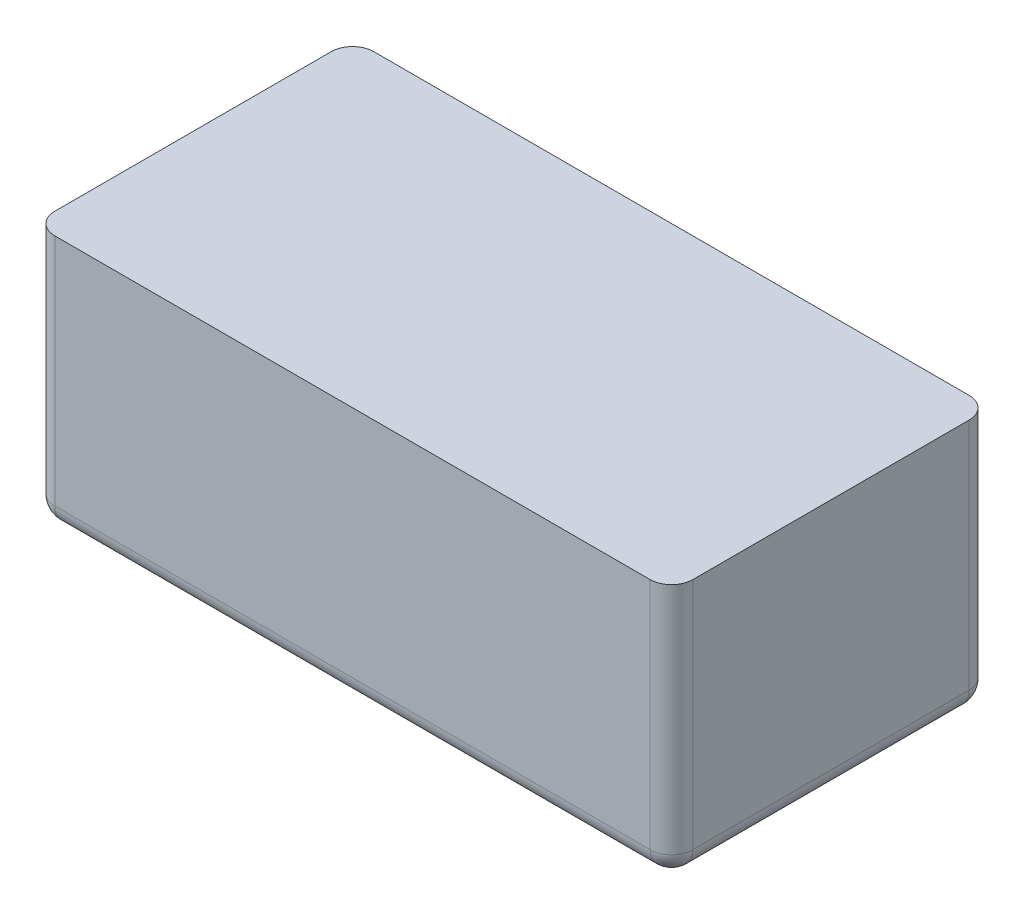
ISO-10303-21;
HEADER;
FILE_DESCRIPTION(('STEP AP214'),'2;1');
FILE_NAME('part.step','',(''),(''),'','','');
FILE_SCHEMA(('AUTOMOTIVE_DESIGN { 1 0 10303 214 1 1 1 1 }'));
ENDSEC;
DATA;
#1=APPLICATION_CONTEXT('core data for automotive mechanical design processes');
#2=APPLICATION_PROTOCOL_DEFINITION('international standard','automotive_design',2000,#1);
#3=PRODUCT_CONTEXT('',#1,'mechanical');
#4=PRODUCT('Part','Part','',(#3));
#5=PRODUCT_RELATED_PRODUCT_CATEGORY('part','',(#4));
#6=PRODUCT_DEFINITION_FORMATION('','',#4);
#7=PRODUCT_DEFINITION_CONTEXT('part definition',#1,'design');
#8=PRODUCT_DEFINITION('design','',#6,#7);
#9=PRODUCT_DEFINITION_SHAPE('','',#8);
#10=(LENGTH_UNIT() NAMED_UNIT(*) SI_UNIT(.MILLI.,.METRE.));
#11=(NAMED_UNIT(*) PLANE_ANGLE_UNIT() SI_UNIT($,.RADIAN.));
#12=(NAMED_UNIT(*) SI_UNIT($,.STERADIAN.) SOLID_ANGLE_UNIT());
#13=UNCERTAINTY_MEASURE_WITH_UNIT(LENGTH_MEASURE(1.E-05),#10,'distance_accuracy_value','');
#14=(GEOMETRIC_REPRESENTATION_CONTEXT(3) GLOBAL_UNCERTAINTY_ASSIGNED_CONTEXT((#13)) GLOBAL_UNIT_ASSIGNED_CONTEXT((#10,
#11,#12)) REPRESENTATION_CONTEXT('',''));
#15=CARTESIAN_POINT('',(0.,0.,0.));
#16=DIRECTION('',(0.,0.,1.));
#17=DIRECTION('',(1.,0.,0.));
#18=AXIS2_PLACEMENT_3D('',#15,#16,#17);
#19=CARTESIAN_POINT('',(-1.398,-2.45,-2.4));
#20=DIRECTION('',(0.,-1.,0.));
#21=DIRECTION('',(0.,0.,1.));
#22=AXIS2_PLACEMENT_3D('',#19,#20,#21);
#23=PLANE('',#22);
#24=DIRECTION('',(0.,0.,1.));
#25=VECTOR('',#24,1.);
#26=CARTESIAN_POINT('',(1.402,-2.45,-2.4));
#27=LINE('',#26,#25);
#28=CARTESIAN_POINT('',(1.402,-2.45,-2.4));
#29=VERTEX_POINT('',#28);
#30=CARTESIAN_POINT('',(1.402,-2.45,-1.1));
#31=VERTEX_POINT('',#30);
#32=EDGE_CURVE('E240',#29,#31,#27,.T.);
#33=ORIENTED_EDGE('',*,*,#32,.T.);
#34=DIRECTION('',(-1.,0.,0.));
#35=VECTOR('',#34,1.);
#36=CARTESIAN_POINT('',(-1.398,-2.45,-1.1));
#37=LINE('',#36,#35);
#38=CARTESIAN_POINT('',(-1.398,-2.45,-1.1));
#39=VERTEX_POINT('',#38);
#40=EDGE_CURVE('E149',#31,#39,#37,.T.);
#41=ORIENTED_EDGE('',*,*,#40,.T.);
#42=DIRECTION('',(0.,0.,-1.));
#43=VECTOR('',#42,1.);
#44=CARTESIAN_POINT('',(-1.398,-2.45,-2.4));
#45=LINE('',#44,#43);
#46=CARTESIAN_POINT('',(-1.398,-2.45,-2.4));
#47=VERTEX_POINT('',#46);
#48=EDGE_CURVE('E122',#39,#47,#45,.T.);
#49=ORIENTED_EDGE('',*,*,#48,.T.);
#50=DIRECTION('',(1.,0.,0.));
#51=VECTOR('',#50,1.);
#52=CARTESIAN_POINT('',(-1.398,-2.45,-2.4));
#53=LINE('',#52,#51);
#54=EDGE_CURVE('E136',#47,#29,#53,.T.);
#55=ORIENTED_EDGE('',*,*,#54,.T.);
#56=EDGE_LOOP('',(#33,#41,#49,#55));
#57=FACE_BOUND('',#56,.T.);
#58=ADVANCED_FACE('F37',(#57),#23,.T.);
#59=CARTESIAN_POINT('',(-1.398,-2.35,-2.4));
#60=DIRECTION('',(1.,0.,0.));
#61=DIRECTION('',(0.,0.,-1.));
#62=AXIS2_PLACEMENT_3D('',#59,#60,#61);
#63=SPHERICAL_SURFACE('',#62,0.1);
#64=CARTESIAN_POINT('',(-1.398,-2.35,-2.4));
#65=DIRECTION('',(-1.,0.,0.));
#66=DIRECTION('',(0.,0.,1.));
#67=AXIS2_PLACEMENT_3D('',#64,#65,#66);
#68=CIRCLE('',#67,0.1);
#69=CARTESIAN_POINT('',(-1.398,-2.35,-2.5));
#70=VERTEX_POINT('',#69);
#71=EDGE_CURVE('E131',#70,#47,#68,.T.);
#72=ORIENTED_EDGE('',*,*,#71,.T.);
#73=CARTESIAN_POINT('',(-1.398,-2.35,-2.4));
#74=DIRECTION('',(0.,0.,1.));
#75=DIRECTION('',(0.,-1.,0.));
#76=AXIS2_PLACEMENT_3D('',#73,#74,#75);
#77=CIRCLE('',#76,0.1);
#78=CARTESIAN_POINT('',(-1.498,-2.35,-2.4));
#79=VERTEX_POINT('',#78);
#80=EDGE_CURVE('E117',#47,#79,#77,.F.);
#81=ORIENTED_EDGE('',*,*,#80,.T.);
#82=CARTESIAN_POINT('',(-1.398,-2.35,-2.4));
#83=DIRECTION('',(0.,-1.,0.));
#84=DIRECTION('',(0.,0.,-1.));
#85=AXIS2_PLACEMENT_3D('',#82,#83,#84);
#86=CIRCLE('',#85,0.1);
#87=EDGE_CURVE('E134',#79,#70,#86,.T.);
#88=ORIENTED_EDGE('',*,*,#87,.T.);
#89=EDGE_LOOP('',(#72,#81,#88));
#90=FACE_BOUND('',#89,.T.);
#91=ADVANCED_FACE('F133',(#90),#63,.T.);
#92=CARTESIAN_POINT('',(-1.398,-2.35,-2.4));
#93=DIRECTION('',(0.,0.,-1.));
#94=DIRECTION('',(0.,-1.,0.));
#95=AXIS2_PLACEMENT_3D('',#92,#93,#94);
#96=CYLINDRICAL_SURFACE('',#95,0.1);
#97=CARTESIAN_POINT('',(-1.398,-2.35,-1.1));
#98=DIRECTION('',(0.,0.,-1.));
#99=DIRECTION('',(-1.,0.,0.));
#100=AXIS2_PLACEMENT_3D('',#97,#98,#99);
#101=CIRCLE('',#100,0.1);
#102=CARTESIAN_POINT('',(-1.498,-2.35,-1.1));
#103=VERTEX_POINT('',#102);
#104=EDGE_CURVE('E150',#39,#103,#101,.T.);
#105=ORIENTED_EDGE('',*,*,#104,.T.);
#106=DIRECTION('',(0.,0.,1.));
#107=VECTOR('',#106,1.);
#108=CARTESIAN_POINT('',(-1.498,-2.35,-2.4));
#109=LINE('',#108,#107);
#110=EDGE_CURVE('E125',#79,#103,#109,.T.);
#111=ORIENTED_EDGE('',*,*,#110,.F.);
#112=ORIENTED_EDGE('',*,*,#80,.F.);
#113=ORIENTED_EDGE('',*,*,#48,.F.);
#114=EDGE_LOOP('',(#105,#111,#112,#113));
#115=FACE_BOUND('',#114,.T.);
#116=ADVANCED_FACE('F120',(#115),#96,.T.);
#117=CARTESIAN_POINT('',(-1.398,-2.35,-1.1));
#118=DIRECTION('',(1.,0.,0.));
#119=DIRECTION('',(0.,-1.,0.));
#120=AXIS2_PLACEMENT_3D('',#117,#118,#119);
#121=SPHERICAL_SURFACE('',#120,0.1);
#122=ORIENTED_EDGE('',*,*,#104,.F.);
#123=CARTESIAN_POINT('',(-1.398,-2.35,-1.1));
#124=DIRECTION('',(1.,0.,0.));
#125=DIRECTION('',(0.,0.,-1.));
#126=AXIS2_PLACEMENT_3D('',#123,#124,#125);
#127=CIRCLE('',#126,0.1);
#128=CARTESIAN_POINT('',(-1.398,-2.35,-1.));
#129=VERTEX_POINT('',#128);
#130=EDGE_CURVE('E250',#39,#129,#127,.F.);
#131=ORIENTED_EDGE('',*,*,#130,.T.);
#132=CARTESIAN_POINT('',(-1.398,-2.35,-1.1));
#133=DIRECTION('',(0.,-1.,0.));
#134=DIRECTION('',(0.,0.,-1.));
#135=AXIS2_PLACEMENT_3D('',#132,#133,#134);
#136=CIRCLE('',#135,0.1);
#137=EDGE_CURVE('E203',#129,#103,#136,.T.);
#138=ORIENTED_EDGE('',*,*,#137,.T.);
#139=EDGE_LOOP('',(#122,#131,#138));
#140=FACE_BOUND('',#139,.T.);
#141=ADVANCED_FACE('F289',(#140),#121,.T.);
#142=CARTESIAN_POINT('',(-1.398,-2.35,-1.1));
#143=DIRECTION('',(-1.,0.,0.));
#144=DIRECTION('',(0.,0.,-1.));
#145=AXIS2_PLACEMENT_3D('',#142,#143,#144);
#146=CYLINDRICAL_SURFACE('',#145,0.1);
#147=ORIENTED_EDGE('',*,*,#130,.F.);
#148=ORIENTED_EDGE('',*,*,#40,.F.);
#149=CARTESIAN_POINT('',(1.402,-2.35,-1.1));
#150=DIRECTION('',(-1.,0.,0.));
#151=DIRECTION('',(0.,0.,1.));
#152=AXIS2_PLACEMENT_3D('',#149,#150,#151);
#153=CIRCLE('',#152,0.1);
#154=CARTESIAN_POINT('',(1.402,-2.35,-1.));
#155=VERTEX_POINT('',#154);
#156=EDGE_CURVE('E247',#31,#155,#153,.T.);
#157=ORIENTED_EDGE('',*,*,#156,.T.);
#158=DIRECTION('',(1.,0.,0.));
#159=VECTOR('',#158,1.);
#160=CARTESIAN_POINT('',(-1.398,-2.35,-1.));
#161=LINE('',#160,#159);
#162=EDGE_CURVE('E198',#129,#155,#161,.T.);
#163=ORIENTED_EDGE('',*,*,#162,.F.);
#164=EDGE_LOOP('',(#147,#148,#157,#163));
#165=FACE_BOUND('',#164,.T.);
#166=ADVANCED_FACE('F285',(#165),#146,.T.);
#167=CARTESIAN_POINT('',(1.402,-2.35,-1.1));
#168=DIRECTION('',(1.,0.,0.));
#169=DIRECTION('',(0.,-1.,0.));
#170=AXIS2_PLACEMENT_3D('',#167,#168,#169);
#171=SPHERICAL_SURFACE('',#170,0.1);
#172=CARTESIAN_POINT('',(1.402,-2.35,-1.1));
#173=DIRECTION('',(0.,0.,-1.));
#174=DIRECTION('',(0.,1.,0.));
#175=AXIS2_PLACEMENT_3D('',#172,#173,#174);
#176=CIRCLE('',#175,0.1);
#177=CARTESIAN_POINT('',(1.502,-2.35,-1.1));
#178=VERTEX_POINT('',#177);
#179=EDGE_CURVE('E231',#31,#178,#176,.F.);
#180=ORIENTED_EDGE('',*,*,#179,.T.);
#181=CARTESIAN_POINT('',(1.402,-2.35,-1.1));
#182=DIRECTION('',(0.,-1.,0.));
#183=DIRECTION('',(0.,0.,-1.));
#184=AXIS2_PLACEMENT_3D('',#181,#182,#183);
#185=CIRCLE('',#184,0.1);
#186=EDGE_CURVE('E192',#178,#155,#185,.T.);
#187=ORIENTED_EDGE('',*,*,#186,.T.);
#188=ORIENTED_EDGE('',*,*,#156,.F.);
#189=EDGE_LOOP('',(#180,#187,#188));
#190=FACE_BOUND('',#189,.T.);
#191=ADVANCED_FACE('F282',(#190),#171,.T.);
#192=CARTESIAN_POINT('',(1.402,-2.35,-2.4));
#193=DIRECTION('',(0.,0.,1.));
#194=DIRECTION('',(0.,1.,0.));
#195=AXIS2_PLACEMENT_3D('',#192,#193,#194);
#196=CYLINDRICAL_SURFACE('',#195,0.1);
#197=ORIENTED_EDGE('',*,*,#179,.F.);
#198=ORIENTED_EDGE('',*,*,#32,.F.);
#199=CARTESIAN_POINT('',(1.402,-2.35,-2.4));
#200=DIRECTION('',(0.,0.,1.));
#201=DIRECTION('',(1.,0.,0.));
#202=AXIS2_PLACEMENT_3D('',#199,#200,#201);
#203=CIRCLE('',#202,0.1);
#204=CARTESIAN_POINT('',(1.502,-2.35,-2.4));
#205=VERTEX_POINT('',#204);
#206=EDGE_CURVE('E137',#29,#205,#203,.T.);
#207=ORIENTED_EDGE('',*,*,#206,.T.);
#208=DIRECTION('',(0.,0.,-1.));
#209=VECTOR('',#208,1.);
#210=CARTESIAN_POINT('',(1.502,-2.35,-2.4));
#211=LINE('',#210,#209);
#212=EDGE_CURVE('E187',#178,#205,#211,.T.);
#213=ORIENTED_EDGE('',*,*,#212,.F.);
#214=EDGE_LOOP('',(#197,#198,#207,#213));
#215=FACE_BOUND('',#214,.T.);
#216=ADVANCED_FACE('F277',(#215),#196,.T.);
#217=CARTESIAN_POINT('',(1.402,-2.35,-2.4));
#218=DIRECTION('',(1.,0.,0.));
#219=DIRECTION('',(0.,0.,-1.));
#220=AXIS2_PLACEMENT_3D('',#217,#218,#219);
#221=SPHERICAL_SURFACE('',#220,0.1);
#222=CARTESIAN_POINT('',(1.402,-2.35,-2.4));
#223=DIRECTION('',(-1.,0.,0.));
#224=DIRECTION('',(0.,0.,1.));
#225=AXIS2_PLACEMENT_3D('',#222,#223,#224);
#226=CIRCLE('',#225,0.1);
#227=CARTESIAN_POINT('',(1.402,-2.35,-2.5));
#228=VERTEX_POINT('',#227);
#229=EDGE_CURVE('E142',#29,#228,#226,.F.);
#230=ORIENTED_EDGE('',*,*,#229,.T.);
#231=CARTESIAN_POINT('',(1.402,-2.35,-2.4));
#232=DIRECTION('',(0.,-1.,0.));
#233=DIRECTION('',(0.,0.,-1.));
#234=AXIS2_PLACEMENT_3D('',#231,#232,#233);
#235=CIRCLE('',#234,0.1);
#236=EDGE_CURVE('E181',#228,#205,#235,.T.);
#237=ORIENTED_EDGE('',*,*,#236,.T.);
#238=ORIENTED_EDGE('',*,*,#206,.F.);
#239=EDGE_LOOP('',(#230,#237,#238));
#240=FACE_BOUND('',#239,.T.);
#241=ADVANCED_FACE('F39',(#240),#221,.T.);
#242=CARTESIAN_POINT('',(-1.398,-2.35,-2.4));
#243=DIRECTION('',(1.,0.,0.));
#244=DIRECTION('',(0.,0.,1.));
#245=AXIS2_PLACEMENT_3D('',#242,#243,#244);
#246=CYLINDRICAL_SURFACE('',#245,0.1);
#247=ORIENTED_EDGE('',*,*,#229,.F.);
#248=ORIENTED_EDGE('',*,*,#54,.F.);
#249=ORIENTED_EDGE('',*,*,#71,.F.);
#250=DIRECTION('',(1.,0.,0.));
#251=VECTOR('',#250,1.);
#252=CARTESIAN_POINT('',(-1.398,-2.35,-2.5));
#253=LINE('',#252,#251);
#254=EDGE_CURVE('E173',#228,#70,#253,.F.);
#255=ORIENTED_EDGE('',*,*,#254,.F.);
#256=EDGE_LOOP('',(#247,#248,#249,#255));
#257=FACE_BOUND('',#256,.T.);
#258=ADVANCED_FACE('F140',(#257),#246,.T.);
#259=CARTESIAN_POINT('',(-1.398,-2.45,-2.4));
#260=DIRECTION('',(0.,1.,0.));
#261=DIRECTION('',(0.,0.,-1.));
#262=AXIS2_PLACEMENT_3D('',#259,#260,#261);
#263=CYLINDRICAL_SURFACE('',#262,0.1);
#264=DIRECTION('',(0.,1.,0.));
#265=VECTOR('',#264,1.);
#266=CARTESIAN_POINT('',(-1.498,-2.45,-2.4));
#267=LINE('',#266,#265);
#268=CARTESIAN_POINT('',(-1.498,-1.25,-2.4));
#269=VERTEX_POINT('',#268);
#270=EDGE_CURVE('E210',#269,#79,#267,.F.);
#271=ORIENTED_EDGE('',*,*,#270,.F.);
#272=CARTESIAN_POINT('',(-1.398,-1.25,-2.4));
#273=DIRECTION('',(0.,-1.,0.));
#274=DIRECTION('',(0.,0.,-1.));
#275=AXIS2_PLACEMENT_3D('',#272,#273,#274);
#276=CIRCLE('',#275,0.1);
#277=CARTESIAN_POINT('',(-1.398,-1.25,-2.5));
#278=VERTEX_POINT('',#277);
#279=EDGE_CURVE('E41',#278,#269,#276,.F.);
#280=ORIENTED_EDGE('',*,*,#279,.F.);
#281=DIRECTION('',(0.,1.,0.));
#282=VECTOR('',#281,1.);
#283=CARTESIAN_POINT('',(-1.398,-2.45,-2.5));
#284=LINE('',#283,#282);
#285=EDGE_CURVE('E177',#70,#278,#284,.T.);
#286=ORIENTED_EDGE('',*,*,#285,.F.);
#287=ORIENTED_EDGE('',*,*,#87,.F.);
#288=EDGE_LOOP('',(#271,#280,#286,#287));
#289=FACE_BOUND('',#288,.T.);
#290=ADVANCED_FACE('F296',(#289),#263,.T.);
#291=CARTESIAN_POINT('',(-1.498,-2.45,-2.4));
#292=DIRECTION('',(1.,0.,0.));
#293=DIRECTION('',(0.,0.,1.));
#294=AXIS2_PLACEMENT_3D('',#291,#292,#293);
#295=PLANE('',#294);
#296=ORIENTED_EDGE('',*,*,#270,.T.);
#297=ORIENTED_EDGE('',*,*,#110,.T.);
#298=DIRECTION('',(0.,1.,0.));
#299=VECTOR('',#298,1.);
#300=CARTESIAN_POINT('',(-1.498,-2.45,-1.1));
#301=LINE('',#300,#299);
#302=CARTESIAN_POINT('',(-1.498,-1.25,-1.1));
#303=VERTEX_POINT('',#302);
#304=EDGE_CURVE('E206',#103,#303,#301,.T.);
#305=ORIENTED_EDGE('',*,*,#304,.T.);
#306=DIRECTION('',(0.,0.,1.));
#307=VECTOR('',#306,1.);
#308=CARTESIAN_POINT('',(-1.498,-1.25,-2.4));
#309=LINE('',#308,#307);
#310=EDGE_CURVE('E166',#269,#303,#309,.T.);
#311=ORIENTED_EDGE('',*,*,#310,.F.);
#312=EDGE_LOOP('',(#296,#297,#305,#311));
#313=FACE_BOUND('',#312,.T.);
#314=ADVANCED_FACE('F292',(#313),#295,.F.);
#315=CARTESIAN_POINT('',(-1.398,-2.45,-1.1));
#316=DIRECTION('',(0.,1.,0.));
#317=DIRECTION('',(0.,0.,-1.));
#318=AXIS2_PLACEMENT_3D('',#315,#316,#317);
#319=CYLINDRICAL_SURFACE('',#318,0.1);
#320=DIRECTION('',(0.,-1.,0.));
#321=VECTOR('',#320,1.);
#322=CARTESIAN_POINT('',(-1.398,-2.45,-1.));
#323=LINE('',#322,#321);
#324=CARTESIAN_POINT('',(-1.398,-1.25,-1.));
#325=VERTEX_POINT('',#324);
#326=EDGE_CURVE('E201',#325,#129,#323,.T.);
#327=ORIENTED_EDGE('',*,*,#326,.F.);
#328=CARTESIAN_POINT('',(-1.398,-1.25,-1.1));
#329=DIRECTION('',(0.,-1.,0.));
#330=DIRECTION('',(0.,0.,-1.));
#331=AXIS2_PLACEMENT_3D('',#328,#329,#330);
#332=CIRCLE('',#331,0.1);
#333=EDGE_CURVE('E164',#303,#325,#332,.F.);
#334=ORIENTED_EDGE('',*,*,#333,.F.);
#335=ORIENTED_EDGE('',*,*,#304,.F.);
#336=ORIENTED_EDGE('',*,*,#137,.F.);
#337=EDGE_LOOP('',(#327,#334,#335,#336));
#338=FACE_BOUND('',#337,.T.);
#339=ADVANCED_FACE('F334',(#338),#319,.T.);
#340=CARTESIAN_POINT('',(-1.398,-2.45,-1.));
#341=DIRECTION('',(0.,0.,-1.));
#342=DIRECTION('',(0.,-1.,0.));
#343=AXIS2_PLACEMENT_3D('',#340,#341,#342);
#344=PLANE('',#343);
#345=ORIENTED_EDGE('',*,*,#326,.T.);
#346=ORIENTED_EDGE('',*,*,#162,.T.);
#347=DIRECTION('',(0.,1.,0.));
#348=VECTOR('',#347,1.);
#349=CARTESIAN_POINT('',(1.402,-2.45,-1.));
#350=LINE('',#349,#348);
#351=CARTESIAN_POINT('',(1.402,-1.25,-1.));
#352=VERTEX_POINT('',#351);
#353=EDGE_CURVE('E195',#155,#352,#350,.T.);
#354=ORIENTED_EDGE('',*,*,#353,.T.);
#355=DIRECTION('',(1.,0.,0.));
#356=VECTOR('',#355,1.);
#357=CARTESIAN_POINT('',(-1.398,-1.25,-1.));
#358=LINE('',#357,#356);
#359=EDGE_CURVE('E163',#325,#352,#358,.T.);
#360=ORIENTED_EDGE('',*,*,#359,.F.);
#361=EDGE_LOOP('',(#345,#346,#354,#360));
#362=FACE_BOUND('',#361,.T.);
#363=ADVANCED_FACE('F337',(#362),#344,.F.);
#364=CARTESIAN_POINT('',(1.402,-2.45,-1.1));
#365=DIRECTION('',(0.,1.,0.));
#366=DIRECTION('',(0.,0.,-1.));
#367=AXIS2_PLACEMENT_3D('',#364,#365,#366);
#368=CYLINDRICAL_SURFACE('',#367,0.1);
#369=DIRECTION('',(0.,1.,0.));
#370=VECTOR('',#369,1.);
#371=CARTESIAN_POINT('',(1.502,-2.45,-1.1));
#372=LINE('',#371,#370);
#373=CARTESIAN_POINT('',(1.502,-1.25,-1.1));
#374=VERTEX_POINT('',#373);
#375=EDGE_CURVE('E190',#374,#178,#372,.F.);
#376=ORIENTED_EDGE('',*,*,#375,.F.);
#377=CARTESIAN_POINT('',(1.402,-1.25,-1.1));
#378=DIRECTION('',(0.,-1.,0.));
#379=DIRECTION('',(0.,0.,-1.));
#380=AXIS2_PLACEMENT_3D('',#377,#378,#379);
#381=CIRCLE('',#380,0.1);
#382=EDGE_CURVE('E161',#352,#374,#381,.F.);
#383=ORIENTED_EDGE('',*,*,#382,.F.);
#384=ORIENTED_EDGE('',*,*,#353,.F.);
#385=ORIENTED_EDGE('',*,*,#186,.F.);
#386=EDGE_LOOP('',(#376,#383,#384,#385));
#387=FACE_BOUND('',#386,.T.);
#388=ADVANCED_FACE('F340',(#387),#368,.T.);
#389=CARTESIAN_POINT('',(1.502,-2.45,-2.4));
#390=DIRECTION('',(-1.,0.,0.));
#391=DIRECTION('',(0.,0.,-1.));
#392=AXIS2_PLACEMENT_3D('',#389,#390,#391);
#393=PLANE('',#392);
#394=ORIENTED_EDGE('',*,*,#375,.T.);
#395=ORIENTED_EDGE('',*,*,#212,.T.);
#396=DIRECTION('',(0.,1.,0.));
#397=VECTOR('',#396,1.);
#398=CARTESIAN_POINT('',(1.502,-2.45,-2.4));
#399=LINE('',#398,#397);
#400=CARTESIAN_POINT('',(1.502,-1.25,-2.4));
#401=VERTEX_POINT('',#400);
#402=EDGE_CURVE('E184',#205,#401,#399,.T.);
#403=ORIENTED_EDGE('',*,*,#402,.T.);
#404=DIRECTION('',(0.,0.,1.));
#405=VECTOR('',#404,1.);
#406=CARTESIAN_POINT('',(1.502,-1.25,-2.4));
#407=LINE('',#406,#405);
#408=EDGE_CURVE('E160',#374,#401,#407,.F.);
#409=ORIENTED_EDGE('',*,*,#408,.F.);
#410=EDGE_LOOP('',(#394,#395,#403,#409));
#411=FACE_BOUND('',#410,.T.);
#412=ADVANCED_FACE('F344',(#411),#393,.F.);
#413=CARTESIAN_POINT('',(1.402,-2.45,-2.4));
#414=DIRECTION('',(0.,1.,0.));
#415=DIRECTION('',(0.,0.,-1.));
#416=AXIS2_PLACEMENT_3D('',#413,#414,#415);
#417=CYLINDRICAL_SURFACE('',#416,0.1);
#418=DIRECTION('',(0.,1.,0.));
#419=VECTOR('',#418,1.);
#420=CARTESIAN_POINT('',(1.402,-2.45,-2.5));
#421=LINE('',#420,#419);
#422=CARTESIAN_POINT('',(1.402,-1.25,-2.5));
#423=VERTEX_POINT('',#422);
#424=EDGE_CURVE('E80',#423,#228,#421,.F.);
#425=ORIENTED_EDGE('',*,*,#424,.F.);
#426=CARTESIAN_POINT('',(1.402,-1.25,-2.4));
#427=DIRECTION('',(0.,-1.,0.));
#428=DIRECTION('',(0.,0.,-1.));
#429=AXIS2_PLACEMENT_3D('',#426,#427,#428);
#430=CIRCLE('',#429,0.1);
#431=EDGE_CURVE('E47',#401,#423,#430,.F.);
#432=ORIENTED_EDGE('',*,*,#431,.F.);
#433=ORIENTED_EDGE('',*,*,#402,.F.);
#434=ORIENTED_EDGE('',*,*,#236,.F.);
#435=EDGE_LOOP('',(#425,#432,#433,#434));
#436=FACE_BOUND('',#435,.T.);
#437=ADVANCED_FACE('F300',(#436),#417,.T.);
#438=CARTESIAN_POINT('',(-1.398,-2.45,-2.5));
#439=DIRECTION('',(0.,0.,1.));
#440=DIRECTION('',(0.,1.,0.));
#441=AXIS2_PLACEMENT_3D('',#438,#439,#440);
#442=PLANE('',#441);
#443=ORIENTED_EDGE('',*,*,#424,.T.);
#444=ORIENTED_EDGE('',*,*,#254,.T.);
#445=ORIENTED_EDGE('',*,*,#285,.T.);
#446=DIRECTION('',(1.,0.,0.));
#447=VECTOR('',#446,1.);
#448=CARTESIAN_POINT('',(-1.398,-1.25,-2.5));
#449=LINE('',#448,#447);
#450=EDGE_CURVE('E11',#423,#278,#449,.F.);
#451=ORIENTED_EDGE('',*,*,#450,.F.);
#452=EDGE_LOOP('',(#443,#444,#445,#451));
#453=FACE_BOUND('',#452,.T.);
#454=ADVANCED_FACE('F297',(#453),#442,.F.);
#455=CARTESIAN_POINT('',(-1.398,-1.25,-2.4));
#456=DIRECTION('',(0.,-1.,0.));
#457=DIRECTION('',(0.,0.,1.));
#458=AXIS2_PLACEMENT_3D('',#455,#456,#457);
#459=PLANE('',#458);
#460=ORIENTED_EDGE('',*,*,#431,.T.);
#461=ORIENTED_EDGE('',*,*,#450,.T.);
#462=ORIENTED_EDGE('',*,*,#279,.T.);
#463=ORIENTED_EDGE('',*,*,#310,.T.);
#464=ORIENTED_EDGE('',*,*,#333,.T.);
#465=ORIENTED_EDGE('',*,*,#359,.T.);
#466=ORIENTED_EDGE('',*,*,#382,.T.);
#467=ORIENTED_EDGE('',*,*,#408,.T.);
#468=EDGE_LOOP('',(#460,#461,#462,#463,#464,#465,#466,#467));
#469=FACE_BOUND('',#468,.T.);
#470=ADVANCED_FACE('F353',(#469),#459,.F.);
#471=CLOSED_SHELL('',(#58,#91,#116,#141,#166,#191,#216,#241,#258,#290,#314,#339,#363,#388,#412,
#437,#454,#470));
#472=MANIFOLD_SOLID_BREP('B2',#471);
#473=ADVANCED_BREP_SHAPE_REPRESENTATION('',(#18,#472),#14);
#474=SHAPE_DEFINITION_REPRESENTATION(#9,#473);
ENDSEC;
END-ISO-10303-21;
